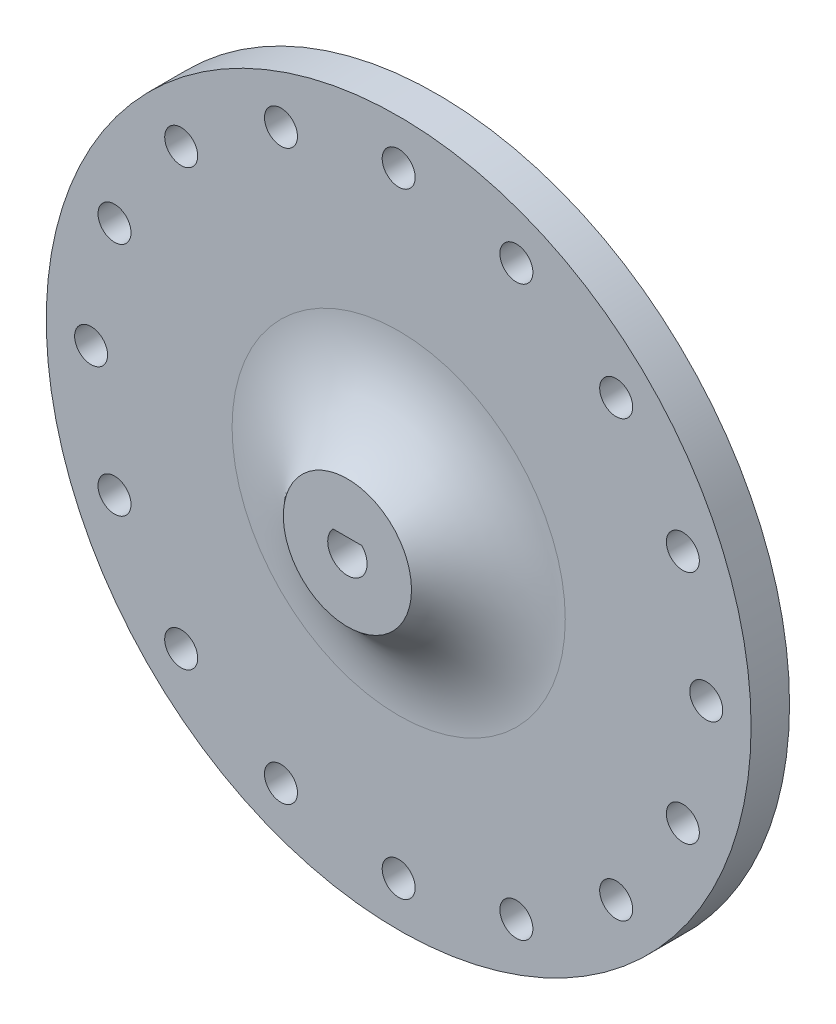
ISO-10303-21;
HEADER;
FILE_DESCRIPTION(('STEP AP214'),'2;1');
FILE_NAME('part.step','',(''),(''),'','','');
FILE_SCHEMA(('AUTOMOTIVE_DESIGN { 1 0 10303 214 1 1 1 1 }'));
ENDSEC;
DATA;
#1=APPLICATION_CONTEXT('core data for automotive mechanical design processes');
#2=APPLICATION_PROTOCOL_DEFINITION('international standard','automotive_design',2000,#1);
#3=PRODUCT_CONTEXT('',#1,'mechanical');
#4=PRODUCT('Part','Part','',(#3));
#5=PRODUCT_RELATED_PRODUCT_CATEGORY('part','',(#4));
#6=PRODUCT_DEFINITION_FORMATION('','',#4);
#7=PRODUCT_DEFINITION_CONTEXT('part definition',#1,'design');
#8=PRODUCT_DEFINITION('design','',#6,#7);
#9=PRODUCT_DEFINITION_SHAPE('','',#8);
#10=(LENGTH_UNIT() NAMED_UNIT(*) SI_UNIT(.MILLI.,.METRE.));
#11=(NAMED_UNIT(*) PLANE_ANGLE_UNIT() SI_UNIT($,.RADIAN.));
#12=(NAMED_UNIT(*) SI_UNIT($,.STERADIAN.) SOLID_ANGLE_UNIT());
#13=UNCERTAINTY_MEASURE_WITH_UNIT(LENGTH_MEASURE(1.E-05),#10,'distance_accuracy_value','');
#14=(GEOMETRIC_REPRESENTATION_CONTEXT(3) GLOBAL_UNCERTAINTY_ASSIGNED_CONTEXT((#13)) GLOBAL_UNIT_ASSIGNED_CONTEXT((#10,
#11,#12)) REPRESENTATION_CONTEXT('',''));
#15=CARTESIAN_POINT('',(0.,0.,0.));
#16=DIRECTION('',(0.,0.,1.));
#17=DIRECTION('',(1.,0.,0.));
#18=AXIS2_PLACEMENT_3D('',#15,#16,#17);
#19=CARTESIAN_POINT('',(0.,0.,6.));
#20=DIRECTION('',(0.,0.,-1.));
#21=DIRECTION('',(-1.,0.,0.));
#22=AXIS2_PLACEMENT_3D('',#19,#20,#21);
#23=CYLINDRICAL_SURFACE('',#22,55.);
#24=CARTESIAN_POINT('',(0.,0.,6.));
#25=DIRECTION('',(0.,0.,1.));
#26=DIRECTION('',(1.,0.,0.));
#27=AXIS2_PLACEMENT_3D('',#24,#25,#26);
#28=CIRCLE('',#27,55.);
#29=CARTESIAN_POINT('',(55.,0.,6.));
#30=VERTEX_POINT('',#29);
#31=EDGE_CURVE('E43',#30,#30,#28,.T.);
#32=ORIENTED_EDGE('',*,*,#31,.F.);
#33=EDGE_LOOP('',(#32));
#34=FACE_BOUND('',#33,.T.);
#35=CARTESIAN_POINT('',(0.,0.,0.));
#36=DIRECTION('',(0.,0.,1.));
#37=DIRECTION('',(1.,0.,0.));
#38=AXIS2_PLACEMENT_3D('',#35,#36,#37);
#39=CIRCLE('',#38,55.);
#40=CARTESIAN_POINT('',(55.,0.,0.));
#41=VERTEX_POINT('',#40);
#42=EDGE_CURVE('E180',#41,#41,#39,.T.);
#43=ORIENTED_EDGE('',*,*,#42,.T.);
#44=EDGE_LOOP('',(#43));
#45=FACE_BOUND('',#44,.T.);
#46=ADVANCED_FACE('F35',(#34,#45),#23,.T.);
#47=CARTESIAN_POINT('',(0.,0.,6.));
#48=DIRECTION('',(0.,0.,1.));
#49=DIRECTION('',(1.,0.,0.));
#50=AXIS2_PLACEMENT_3D('',#47,#48,#49);
#51=PLANE('',#50);
#52=CARTESIAN_POINT('',(33.9411254969543,33.9411254969542,6.));
#53=DIRECTION('',(0.,0.,1.));
#54=DIRECTION('',(0.707106781186546,-0.707106781186549,0.));
#55=AXIS2_PLACEMENT_3D('',#52,#53,#54);
#56=CIRCLE('',#55,2.575);
#57=CARTESIAN_POINT('',(35.7619254585097,32.1203255353989,6.));
#58=VERTEX_POINT('',#57);
#59=EDGE_CURVE('E119',#58,#58,#56,.T.);
#60=ORIENTED_EDGE('',*,*,#59,.F.);
#61=EDGE_LOOP('',(#60));
#62=FACE_BOUND('',#61,.T.);
#63=CARTESIAN_POINT('',(44.3462175605418,18.3688047535242,6.));
#64=DIRECTION('',(0.,0.,1.));
#65=DIRECTION('',(0.382683432365087,-0.923879532511288,0.));
#66=AXIS2_PLACEMENT_3D('',#63,#64,#65);
#67=CIRCLE('',#66,2.575);
#68=CARTESIAN_POINT('',(45.3316273988819,15.9898149573076,6.));
#69=VERTEX_POINT('',#68);
#70=EDGE_CURVE('E125',#69,#69,#67,.T.);
#71=ORIENTED_EDGE('',*,*,#70,.F.);
#72=EDGE_LOOP('',(#71));
#73=FACE_BOUND('',#72,.T.);
#74=CARTESIAN_POINT('',(48.,-1.6759110426447E-13,6.));
#75=DIRECTION('',(0.,0.,1.));
#76=DIRECTION('',(0.,-1.,0.));
#77=AXIS2_PLACEMENT_3D('',#74,#75,#76);
#78=CIRCLE('',#77,2.575);
#79=CARTESIAN_POINT('',(48.,-2.57500000000017,6.));
#80=VERTEX_POINT('',#79);
#81=EDGE_CURVE('E131',#80,#80,#78,.T.);
#82=ORIENTED_EDGE('',*,*,#81,.F.);
#83=EDGE_LOOP('',(#82));
#84=FACE_BOUND('',#83,.T.);
#85=CARTESIAN_POINT('',(44.3462175605417,-18.3688047535245,6.));
#86=DIRECTION('',(0.,0.,1.));
#87=DIRECTION('',(-0.382683432365094,-0.923879532511285,0.));
#88=AXIS2_PLACEMENT_3D('',#85,#86,#87);
#89=CIRCLE('',#88,2.575);
#90=CARTESIAN_POINT('',(43.3608077222016,-20.7477945497411,6.));
#91=VERTEX_POINT('',#90);
#92=EDGE_CURVE('E137',#91,#91,#89,.T.);
#93=ORIENTED_EDGE('',*,*,#92,.F.);
#94=EDGE_LOOP('',(#93));
#95=FACE_BOUND('',#94,.T.);
#96=CARTESIAN_POINT('',(33.9411254969541,-33.9411254969545,6.));
#97=DIRECTION('',(0.,0.,1.));
#98=DIRECTION('',(-0.707106781186551,-0.707106781186544,0.));
#99=AXIS2_PLACEMENT_3D('',#96,#97,#98);
#100=CIRCLE('',#99,2.575);
#101=CARTESIAN_POINT('',(32.1203255353987,-35.7619254585098,6.));
#102=VERTEX_POINT('',#101);
#103=EDGE_CURVE('E143',#102,#102,#100,.T.);
#104=ORIENTED_EDGE('',*,*,#103,.F.);
#105=EDGE_LOOP('',(#104));
#106=FACE_BOUND('',#105,.T.);
#107=CARTESIAN_POINT('',(18.368804753524,-44.3462175605419,6.));
#108=DIRECTION('',(0.,0.,1.));
#109=DIRECTION('',(-0.923879532511289,-0.382683432365084,0.));
#110=AXIS2_PLACEMENT_3D('',#107,#108,#109);
#111=CIRCLE('',#110,2.575);
#112=CARTESIAN_POINT('',(15.9898149573075,-45.331627398882,6.));
#113=VERTEX_POINT('',#112);
#114=EDGE_CURVE('E149',#113,#113,#111,.T.);
#115=ORIENTED_EDGE('',*,*,#114,.F.);
#116=EDGE_LOOP('',(#115));
#117=FACE_BOUND('',#116,.T.);
#118=CARTESIAN_POINT('',(0.,-48.,6.));
#119=DIRECTION('',(0.,0.,1.));
#120=DIRECTION('',(-1.,0.,0.));
#121=AXIS2_PLACEMENT_3D('',#118,#119,#120);
#122=CIRCLE('',#121,2.575);
#123=CARTESIAN_POINT('',(-2.575,-48.,6.));
#124=VERTEX_POINT('',#123);
#125=EDGE_CURVE('E155',#124,#124,#122,.T.);
#126=ORIENTED_EDGE('',*,*,#125,.F.);
#127=EDGE_LOOP('',(#126));
#128=FACE_BOUND('',#127,.T.);
#129=CARTESIAN_POINT('',(-18.3688047535247,-44.3462175605416,6.));
#130=DIRECTION('',(0.,0.,1.));
#131=DIRECTION('',(-0.923879532511284,0.382683432365097,0.));
#132=AXIS2_PLACEMENT_3D('',#129,#130,#131);
#133=CIRCLE('',#132,2.575);
#134=CARTESIAN_POINT('',(-20.7477945497412,-43.3608077222015,6.));
#135=VERTEX_POINT('',#134);
#136=EDGE_CURVE('E82',#135,#135,#133,.T.);
#137=ORIENTED_EDGE('',*,*,#136,.F.);
#138=EDGE_LOOP('',(#137));
#139=FACE_BOUND('',#138,.T.);
#140=CARTESIAN_POINT('',(-33.9411254969546,-33.941125496954,6.));
#141=DIRECTION('',(0.,0.,1.));
#142=DIRECTION('',(-0.707106781186541,0.707106781186554,0.));
#143=AXIS2_PLACEMENT_3D('',#140,#141,#142);
#144=CIRCLE('',#143,2.575);
#145=CARTESIAN_POINT('',(-35.7619254585099,-32.1203255353986,6.));
#146=VERTEX_POINT('',#145);
#147=EDGE_CURVE('E83',#146,#146,#144,.T.);
#148=ORIENTED_EDGE('',*,*,#147,.F.);
#149=EDGE_LOOP('',(#148));
#150=FACE_BOUND('',#149,.T.);
#151=CARTESIAN_POINT('',(-44.346217560542,-18.3688047535239,6.));
#152=DIRECTION('',(0.,0.,1.));
#153=DIRECTION('',(-0.382683432365081,0.923879532511291,0.));
#154=AXIS2_PLACEMENT_3D('',#151,#152,#153);
#155=CIRCLE('',#154,2.575);
#156=CARTESIAN_POINT('',(-45.331627398882,-15.9898149573073,6.));
#157=VERTEX_POINT('',#156);
#158=EDGE_CURVE('E89',#157,#157,#155,.T.);
#159=ORIENTED_EDGE('',*,*,#158,.F.);
#160=EDGE_LOOP('',(#159));
#161=FACE_BOUND('',#160,.T.);
#162=CARTESIAN_POINT('',(-48.,5.02773312793411E-13,6.));
#163=DIRECTION('',(0.,0.,1.));
#164=DIRECTION('',(0.,1.,0.));
#165=AXIS2_PLACEMENT_3D('',#162,#163,#164);
#166=CIRCLE('',#165,2.575);
#167=CARTESIAN_POINT('',(-48.,2.5750000000005,6.));
#168=VERTEX_POINT('',#167);
#169=EDGE_CURVE('E95',#168,#168,#166,.T.);
#170=ORIENTED_EDGE('',*,*,#169,.F.);
#171=EDGE_LOOP('',(#170));
#172=FACE_BOUND('',#171,.T.);
#173=CARTESIAN_POINT('',(-44.3462175605416,18.3688047535248,6.));
#174=DIRECTION('',(0.,0.,1.));
#175=DIRECTION('',(0.3826834323651,0.923879532511283,0.));
#176=AXIS2_PLACEMENT_3D('',#173,#174,#175);
#177=CIRCLE('',#176,2.575);
#178=CARTESIAN_POINT('',(-43.3608077222014,20.7477945497413,6.));
#179=VERTEX_POINT('',#178);
#180=EDGE_CURVE('E101',#179,#179,#177,.T.);
#181=ORIENTED_EDGE('',*,*,#180,.F.);
#182=EDGE_LOOP('',(#181));
#183=FACE_BOUND('',#182,.T.);
#184=CARTESIAN_POINT('',(-33.9411254969539,33.9411254969547,6.));
#185=DIRECTION('',(0.,0.,1.));
#186=DIRECTION('',(0.707106781186556,0.707106781186539,0.));
#187=AXIS2_PLACEMENT_3D('',#184,#185,#186);
#188=CIRCLE('',#187,2.575);
#189=CARTESIAN_POINT('',(-32.1203255353985,35.76192545851,6.));
#190=VERTEX_POINT('',#189);
#191=EDGE_CURVE('E107',#190,#190,#188,.T.);
#192=ORIENTED_EDGE('',*,*,#191,.F.);
#193=EDGE_LOOP('',(#192));
#194=FACE_BOUND('',#193,.T.);
#195=CARTESIAN_POINT('',(-18.3688047535237,44.346217560542,6.));
#196=DIRECTION('',(0.,0.,1.));
#197=DIRECTION('',(0.923879532511292,0.382683432365077,0.));
#198=AXIS2_PLACEMENT_3D('',#195,#196,#197);
#199=CIRCLE('',#198,2.575);
#200=CARTESIAN_POINT('',(-15.9898149573071,45.3316273988821,6.));
#201=VERTEX_POINT('',#200);
#202=EDGE_CURVE('E73',#201,#201,#199,.T.);
#203=ORIENTED_EDGE('',*,*,#202,.F.);
#204=EDGE_LOOP('',(#203));
#205=FACE_BOUND('',#204,.T.);
#206=CARTESIAN_POINT('',(18.3688047535244,44.3462175605418,6.));
#207=DIRECTION('',(0.,0.,1.));
#208=DIRECTION('',(0.923879532511287,-0.382683432365091,0.));
#209=AXIS2_PLACEMENT_3D('',#206,#207,#208);
#210=CIRCLE('',#209,2.575);
#211=CARTESIAN_POINT('',(20.7477945497409,43.3608077222016,6.));
#212=VERTEX_POINT('',#211);
#213=EDGE_CURVE('E118',#212,#212,#210,.T.);
#214=ORIENTED_EDGE('',*,*,#213,.F.);
#215=EDGE_LOOP('',(#214));
#216=FACE_BOUND('',#215,.T.);
#217=CARTESIAN_POINT('',(0.,48.,6.));
#218=DIRECTION('',(0.,0.,1.));
#219=DIRECTION('',(1.,0.,0.));
#220=AXIS2_PLACEMENT_3D('',#217,#218,#219);
#221=CIRCLE('',#220,2.575);
#222=CARTESIAN_POINT('',(2.575,48.,6.));
#223=VERTEX_POINT('',#222);
#224=EDGE_CURVE('E166',#223,#223,#221,.T.);
#225=ORIENTED_EDGE('',*,*,#224,.F.);
#226=EDGE_LOOP('',(#225));
#227=FACE_BOUND('',#226,.T.);
#228=CARTESIAN_POINT('',(0.,0.,6.));
#229=DIRECTION('',(0.,0.,1.));
#230=DIRECTION('',(1.,0.,0.));
#231=AXIS2_PLACEMENT_3D('',#228,#229,#230);
#232=CIRCLE('',#231,26.);
#233=CARTESIAN_POINT('',(26.,0.,6.));
#234=VERTEX_POINT('',#233);
#235=EDGE_CURVE('E11',#234,#234,#232,.F.);
#236=ORIENTED_EDGE('',*,*,#235,.T.);
#237=EDGE_LOOP('',(#236));
#238=FACE_BOUND('',#237,.T.);
#239=ORIENTED_EDGE('',*,*,#31,.T.);
#240=EDGE_LOOP('',(#239));
#241=FACE_BOUND('',#240,.T.);
#242=ADVANCED_FACE('F188',(#62,#73,#84,#95,#106,#117,#128,#139,#150,#161,#172,#183,#194,#205,
#216,#227,#238,#241),#51,.T.);
#243=CARTESIAN_POINT('',(0.,0.,0.));
#244=DIRECTION('',(0.,0.,1.));
#245=DIRECTION('',(1.,0.,0.));
#246=AXIS2_PLACEMENT_3D('',#243,#244,#245);
#247=PLANE('',#246);
#248=DIRECTION('',(-1.,0.,0.));
#249=VECTOR('',#248,1.);
#250=CARTESIAN_POINT('',(2.24624686978079,2.1,0.));
#251=LINE('',#250,#249);
#252=CARTESIAN_POINT('',(2.24624686978079,2.1,0.));
#253=VERTEX_POINT('',#252);
#254=CARTESIAN_POINT('',(-2.24624686978079,2.1,0.));
#255=VERTEX_POINT('',#254);
#256=EDGE_CURVE('E70',#253,#255,#251,.T.);
#257=ORIENTED_EDGE('',*,*,#256,.T.);
#258=CARTESIAN_POINT('',(0.,0.,0.));
#259=DIRECTION('',(0.,0.,1.));
#260=DIRECTION('',(1.,0.,0.));
#261=AXIS2_PLACEMENT_3D('',#258,#259,#260);
#262=CIRCLE('',#261,3.075);
#263=EDGE_CURVE('E63',#255,#253,#262,.T.);
#264=ORIENTED_EDGE('',*,*,#263,.T.);
#265=EDGE_LOOP('',(#257,#264));
#266=FACE_BOUND('',#265,.T.);
#267=CARTESIAN_POINT('',(33.9411254969543,33.9411254969542,0.));
#268=DIRECTION('',(0.,0.,1.));
#269=DIRECTION('',(0.707106781186546,-0.707106781186549,0.));
#270=AXIS2_PLACEMENT_3D('',#267,#268,#269);
#271=CIRCLE('',#270,2.575);
#272=CARTESIAN_POINT('',(35.7619254585097,32.1203255353989,0.));
#273=VERTEX_POINT('',#272);
#274=EDGE_CURVE('E115',#273,#273,#271,.T.);
#275=ORIENTED_EDGE('',*,*,#274,.T.);
#276=EDGE_LOOP('',(#275));
#277=FACE_BOUND('',#276,.T.);
#278=CARTESIAN_POINT('',(44.3462175605418,18.3688047535242,0.));
#279=DIRECTION('',(0.,0.,1.));
#280=DIRECTION('',(0.382683432365087,-0.923879532511288,0.));
#281=AXIS2_PLACEMENT_3D('',#278,#279,#280);
#282=CIRCLE('',#281,2.575);
#283=CARTESIAN_POINT('',(45.3316273988819,15.9898149573076,0.));
#284=VERTEX_POINT('',#283);
#285=EDGE_CURVE('E122',#284,#284,#282,.T.);
#286=ORIENTED_EDGE('',*,*,#285,.T.);
#287=EDGE_LOOP('',(#286));
#288=FACE_BOUND('',#287,.T.);
#289=CARTESIAN_POINT('',(48.,-1.6759110426447E-13,0.));
#290=DIRECTION('',(0.,0.,1.));
#291=DIRECTION('',(0.,-1.,0.));
#292=AXIS2_PLACEMENT_3D('',#289,#290,#291);
#293=CIRCLE('',#292,2.575);
#294=CARTESIAN_POINT('',(48.,-2.57500000000017,0.));
#295=VERTEX_POINT('',#294);
#296=EDGE_CURVE('E128',#295,#295,#293,.T.);
#297=ORIENTED_EDGE('',*,*,#296,.T.);
#298=EDGE_LOOP('',(#297));
#299=FACE_BOUND('',#298,.T.);
#300=CARTESIAN_POINT('',(44.3462175605417,-18.3688047535245,0.));
#301=DIRECTION('',(0.,0.,1.));
#302=DIRECTION('',(-0.382683432365094,-0.923879532511285,0.));
#303=AXIS2_PLACEMENT_3D('',#300,#301,#302);
#304=CIRCLE('',#303,2.575);
#305=CARTESIAN_POINT('',(43.3608077222016,-20.7477945497411,0.));
#306=VERTEX_POINT('',#305);
#307=EDGE_CURVE('E134',#306,#306,#304,.T.);
#308=ORIENTED_EDGE('',*,*,#307,.T.);
#309=EDGE_LOOP('',(#308));
#310=FACE_BOUND('',#309,.T.);
#311=CARTESIAN_POINT('',(33.9411254969541,-33.9411254969545,0.));
#312=DIRECTION('',(0.,0.,1.));
#313=DIRECTION('',(-0.707106781186551,-0.707106781186544,0.));
#314=AXIS2_PLACEMENT_3D('',#311,#312,#313);
#315=CIRCLE('',#314,2.575);
#316=CARTESIAN_POINT('',(32.1203255353987,-35.7619254585098,0.));
#317=VERTEX_POINT('',#316);
#318=EDGE_CURVE('E140',#317,#317,#315,.T.);
#319=ORIENTED_EDGE('',*,*,#318,.T.);
#320=EDGE_LOOP('',(#319));
#321=FACE_BOUND('',#320,.T.);
#322=CARTESIAN_POINT('',(18.368804753524,-44.3462175605419,0.));
#323=DIRECTION('',(0.,0.,1.));
#324=DIRECTION('',(-0.923879532511289,-0.382683432365084,0.));
#325=AXIS2_PLACEMENT_3D('',#322,#323,#324);
#326=CIRCLE('',#325,2.575);
#327=CARTESIAN_POINT('',(15.9898149573075,-45.331627398882,0.));
#328=VERTEX_POINT('',#327);
#329=EDGE_CURVE('E146',#328,#328,#326,.T.);
#330=ORIENTED_EDGE('',*,*,#329,.T.);
#331=EDGE_LOOP('',(#330));
#332=FACE_BOUND('',#331,.T.);
#333=CARTESIAN_POINT('',(0.,-48.,0.));
#334=DIRECTION('',(0.,0.,1.));
#335=DIRECTION('',(-1.,0.,0.));
#336=AXIS2_PLACEMENT_3D('',#333,#334,#335);
#337=CIRCLE('',#336,2.575);
#338=CARTESIAN_POINT('',(-2.575,-48.,0.));
#339=VERTEX_POINT('',#338);
#340=EDGE_CURVE('E152',#339,#339,#337,.T.);
#341=ORIENTED_EDGE('',*,*,#340,.T.);
#342=EDGE_LOOP('',(#341));
#343=FACE_BOUND('',#342,.T.);
#344=CARTESIAN_POINT('',(-18.3688047535247,-44.3462175605416,0.));
#345=DIRECTION('',(0.,0.,1.));
#346=DIRECTION('',(-0.923879532511284,0.382683432365097,0.));
#347=AXIS2_PLACEMENT_3D('',#344,#345,#346);
#348=CIRCLE('',#347,2.575);
#349=CARTESIAN_POINT('',(-20.7477945497412,-43.3608077222015,0.));
#350=VERTEX_POINT('',#349);
#351=EDGE_CURVE('E158',#350,#350,#348,.T.);
#352=ORIENTED_EDGE('',*,*,#351,.T.);
#353=EDGE_LOOP('',(#352));
#354=FACE_BOUND('',#353,.T.);
#355=CARTESIAN_POINT('',(-33.9411254969546,-33.941125496954,0.));
#356=DIRECTION('',(0.,0.,1.));
#357=DIRECTION('',(-0.707106781186541,0.707106781186554,0.));
#358=AXIS2_PLACEMENT_3D('',#355,#356,#357);
#359=CIRCLE('',#358,2.575);
#360=CARTESIAN_POINT('',(-35.7619254585099,-32.1203255353986,0.));
#361=VERTEX_POINT('',#360);
#362=EDGE_CURVE('E79',#361,#361,#359,.T.);
#363=ORIENTED_EDGE('',*,*,#362,.T.);
#364=EDGE_LOOP('',(#363));
#365=FACE_BOUND('',#364,.T.);
#366=CARTESIAN_POINT('',(-44.346217560542,-18.3688047535239,0.));
#367=DIRECTION('',(0.,0.,1.));
#368=DIRECTION('',(-0.382683432365081,0.923879532511291,0.));
#369=AXIS2_PLACEMENT_3D('',#366,#367,#368);
#370=CIRCLE('',#369,2.575);
#371=CARTESIAN_POINT('',(-45.331627398882,-15.9898149573073,0.));
#372=VERTEX_POINT('',#371);
#373=EDGE_CURVE('E86',#372,#372,#370,.T.);
#374=ORIENTED_EDGE('',*,*,#373,.T.);
#375=EDGE_LOOP('',(#374));
#376=FACE_BOUND('',#375,.T.);
#377=CARTESIAN_POINT('',(-48.,5.02773312793411E-13,0.));
#378=DIRECTION('',(0.,0.,1.));
#379=DIRECTION('',(0.,1.,0.));
#380=AXIS2_PLACEMENT_3D('',#377,#378,#379);
#381=CIRCLE('',#380,2.575);
#382=CARTESIAN_POINT('',(-48.,2.5750000000005,0.));
#383=VERTEX_POINT('',#382);
#384=EDGE_CURVE('E92',#383,#383,#381,.T.);
#385=ORIENTED_EDGE('',*,*,#384,.T.);
#386=EDGE_LOOP('',(#385));
#387=FACE_BOUND('',#386,.T.);
#388=CARTESIAN_POINT('',(-44.3462175605416,18.3688047535248,0.));
#389=DIRECTION('',(0.,0.,1.));
#390=DIRECTION('',(0.3826834323651,0.923879532511283,0.));
#391=AXIS2_PLACEMENT_3D('',#388,#389,#390);
#392=CIRCLE('',#391,2.575);
#393=CARTESIAN_POINT('',(-43.3608077222014,20.7477945497413,0.));
#394=VERTEX_POINT('',#393);
#395=EDGE_CURVE('E98',#394,#394,#392,.T.);
#396=ORIENTED_EDGE('',*,*,#395,.T.);
#397=EDGE_LOOP('',(#396));
#398=FACE_BOUND('',#397,.T.);
#399=CARTESIAN_POINT('',(-33.9411254969539,33.9411254969547,0.));
#400=DIRECTION('',(0.,0.,1.));
#401=DIRECTION('',(0.707106781186556,0.707106781186539,0.));
#402=AXIS2_PLACEMENT_3D('',#399,#400,#401);
#403=CIRCLE('',#402,2.575);
#404=CARTESIAN_POINT('',(-32.1203255353985,35.76192545851,0.));
#405=VERTEX_POINT('',#404);
#406=EDGE_CURVE('E104',#405,#405,#403,.T.);
#407=ORIENTED_EDGE('',*,*,#406,.T.);
#408=EDGE_LOOP('',(#407));
#409=FACE_BOUND('',#408,.T.);
#410=CARTESIAN_POINT('',(-18.3688047535237,44.346217560542,0.));
#411=DIRECTION('',(0.,0.,1.));
#412=DIRECTION('',(0.923879532511292,0.382683432365077,0.));
#413=AXIS2_PLACEMENT_3D('',#410,#411,#412);
#414=CIRCLE('',#413,2.575);
#415=CARTESIAN_POINT('',(-15.9898149573071,45.3316273988821,0.));
#416=VERTEX_POINT('',#415);
#417=EDGE_CURVE('E110',#416,#416,#414,.T.);
#418=ORIENTED_EDGE('',*,*,#417,.T.);
#419=EDGE_LOOP('',(#418));
#420=FACE_BOUND('',#419,.T.);
#421=CARTESIAN_POINT('',(18.3688047535244,44.3462175605418,0.));
#422=DIRECTION('',(0.,0.,1.));
#423=DIRECTION('',(0.923879532511287,-0.382683432365091,0.));
#424=AXIS2_PLACEMENT_3D('',#421,#422,#423);
#425=CIRCLE('',#424,2.575);
#426=CARTESIAN_POINT('',(20.7477945497409,43.3608077222016,0.));
#427=VERTEX_POINT('',#426);
#428=EDGE_CURVE('E163',#427,#427,#425,.T.);
#429=ORIENTED_EDGE('',*,*,#428,.T.);
#430=EDGE_LOOP('',(#429));
#431=FACE_BOUND('',#430,.T.);
#432=CARTESIAN_POINT('',(0.,48.,0.));
#433=DIRECTION('',(0.,0.,1.));
#434=DIRECTION('',(1.,0.,0.));
#435=AXIS2_PLACEMENT_3D('',#432,#433,#434);
#436=CIRCLE('',#435,2.575);
#437=CARTESIAN_POINT('',(2.575,48.,0.));
#438=VERTEX_POINT('',#437);
#439=EDGE_CURVE('E169',#438,#438,#436,.T.);
#440=ORIENTED_EDGE('',*,*,#439,.T.);
#441=EDGE_LOOP('',(#440));
#442=FACE_BOUND('',#441,.T.);
#443=ORIENTED_EDGE('',*,*,#42,.F.);
#444=EDGE_LOOP('',(#443));
#445=FACE_BOUND('',#444,.T.);
#446=ADVANCED_FACE('F75',(#266,#277,#288,#299,#310,#321,#332,#343,#354,#365,#376,#387,#398,#409,
#420,#431,#442,#445),#247,.F.);
#447=CARTESIAN_POINT('',(0.,0.,14.));
#448=DIRECTION('',(0.,0.,1.));
#449=DIRECTION('',(1.,0.,0.));
#450=AXIS2_PLACEMENT_3D('',#447,#448,#449);
#451=PLANE('',#450);
#452=CARTESIAN_POINT('',(0.,0.,14.));
#453=DIRECTION('',(0.,0.,1.));
#454=DIRECTION('',(1.,0.,0.));
#455=AXIS2_PLACEMENT_3D('',#452,#453,#454);
#456=CIRCLE('',#455,10.);
#457=CARTESIAN_POINT('',(10.,0.,14.));
#458=VERTEX_POINT('',#457);
#459=EDGE_CURVE('E68',#458,#458,#456,.T.);
#460=ORIENTED_EDGE('',*,*,#459,.T.);
#461=EDGE_LOOP('',(#460));
#462=FACE_BOUND('',#461,.T.);
#463=DIRECTION('',(-1.,0.,0.));
#464=VECTOR('',#463,1.);
#465=CARTESIAN_POINT('',(-2.24624686978079,2.1,14.));
#466=LINE('',#465,#464);
#467=CARTESIAN_POINT('',(2.24624686978079,2.1,14.));
#468=VERTEX_POINT('',#467);
#469=CARTESIAN_POINT('',(-2.24624686978079,2.1,14.));
#470=VERTEX_POINT('',#469);
#471=EDGE_CURVE('E175',#468,#470,#466,.T.);
#472=ORIENTED_EDGE('',*,*,#471,.F.);
#473=CARTESIAN_POINT('',(0.,0.,14.));
#474=DIRECTION('',(0.,0.,1.));
#475=DIRECTION('',(1.,0.,0.));
#476=AXIS2_PLACEMENT_3D('',#473,#474,#475);
#477=CIRCLE('',#476,3.075);
#478=EDGE_CURVE('E66',#470,#468,#477,.T.);
#479=ORIENTED_EDGE('',*,*,#478,.F.);
#480=EDGE_LOOP('',(#472,#479));
#481=FACE_BOUND('',#480,.T.);
#482=ADVANCED_FACE('F187',(#462,#481),#451,.T.);
#483=CARTESIAN_POINT('',(0.,0.,14.));
#484=DIRECTION('',(0.,0.,-1.));
#485=DIRECTION('',(-1.,0.,0.));
#486=AXIS2_PLACEMENT_3D('',#483,#484,#485);
#487=CYLINDRICAL_SURFACE('',#486,3.075);
#488=DIRECTION('',(0.,0.,-1.));
#489=VECTOR('',#488,1.);
#490=CARTESIAN_POINT('',(2.24624686978079,2.1,14.));
#491=LINE('',#490,#489);
#492=EDGE_CURVE('E55',#468,#253,#491,.T.);
#493=ORIENTED_EDGE('',*,*,#492,.T.);
#494=ORIENTED_EDGE('',*,*,#263,.F.);
#495=DIRECTION('',(0.,0.,-1.));
#496=VECTOR('',#495,1.);
#497=CARTESIAN_POINT('',(-2.24624686978079,2.1,14.));
#498=LINE('',#497,#496);
#499=EDGE_CURVE('E50',#470,#255,#498,.T.);
#500=ORIENTED_EDGE('',*,*,#499,.F.);
#501=ORIENTED_EDGE('',*,*,#478,.T.);
#502=EDGE_LOOP('',(#493,#494,#500,#501));
#503=FACE_BOUND('',#502,.T.);
#504=ADVANCED_FACE('F61',(#503),#487,.F.);
#505=CARTESIAN_POINT('',(-2.24624686978079,2.1,14.));
#506=DIRECTION('',(0.,-1.,0.));
#507=DIRECTION('',(0.,0.,-1.));
#508=AXIS2_PLACEMENT_3D('',#505,#506,#507);
#509=PLANE('',#508);
#510=ORIENTED_EDGE('',*,*,#499,.T.);
#511=ORIENTED_EDGE('',*,*,#256,.F.);
#512=ORIENTED_EDGE('',*,*,#492,.F.);
#513=ORIENTED_EDGE('',*,*,#471,.T.);
#514=EDGE_LOOP('',(#510,#511,#512,#513));
#515=FACE_BOUND('',#514,.T.);
#516=ADVANCED_FACE('F71',(#515),#509,.T.);
#517=CARTESIAN_POINT('',(0.,0.,26.));
#518=DIRECTION('',(0.,0.,1.));
#519=DIRECTION('',(1.,0.,0.));
#520=AXIS2_PLACEMENT_3D('',#517,#518,#519);
#521=TOROIDAL_SURFACE('',#520,26.,20.);
#522=ORIENTED_EDGE('',*,*,#235,.F.);
#523=EDGE_LOOP('',(#522));
#524=FACE_BOUND('',#523,.T.);
#525=ORIENTED_EDGE('',*,*,#459,.F.);
#526=EDGE_LOOP('',(#525));
#527=FACE_BOUND('',#526,.T.);
#528=ADVANCED_FACE('F37',(#524,#527),#521,.F.);
#529=CARTESIAN_POINT('',(0.,48.,0.));
#530=DIRECTION('',(0.,0.,1.));
#531=DIRECTION('',(1.,0.,0.));
#532=AXIS2_PLACEMENT_3D('',#529,#530,#531);
#533=CYLINDRICAL_SURFACE('',#532,2.575);
#534=ORIENTED_EDGE('',*,*,#439,.F.);
#535=EDGE_LOOP('',(#534));
#536=FACE_BOUND('',#535,.T.);
#537=ORIENTED_EDGE('',*,*,#224,.T.);
#538=EDGE_LOOP('',(#537));
#539=FACE_BOUND('',#538,.T.);
#540=ADVANCED_FACE('F216',(#536,#539),#533,.F.);
#541=CARTESIAN_POINT('',(18.3688047535244,44.3462175605418,0.));
#542=DIRECTION('',(0.,0.,1.));
#543=DIRECTION('',(1.,0.,0.));
#544=AXIS2_PLACEMENT_3D('',#541,#542,#543);
#545=CYLINDRICAL_SURFACE('',#544,2.575);
#546=ORIENTED_EDGE('',*,*,#428,.F.);
#547=EDGE_LOOP('',(#546));
#548=FACE_BOUND('',#547,.T.);
#549=ORIENTED_EDGE('',*,*,#213,.T.);
#550=EDGE_LOOP('',(#549));
#551=FACE_BOUND('',#550,.T.);
#552=ADVANCED_FACE('F221',(#548,#551),#545,.F.);
#553=CARTESIAN_POINT('',(-18.3688047535237,44.346217560542,0.));
#554=DIRECTION('',(0.,0.,1.));
#555=DIRECTION('',(1.,0.,0.));
#556=AXIS2_PLACEMENT_3D('',#553,#554,#555);
#557=CYLINDRICAL_SURFACE('',#556,2.575);
#558=ORIENTED_EDGE('',*,*,#417,.F.);
#559=EDGE_LOOP('',(#558));
#560=FACE_BOUND('',#559,.T.);
#561=ORIENTED_EDGE('',*,*,#202,.T.);
#562=EDGE_LOOP('',(#561));
#563=FACE_BOUND('',#562,.T.);
#564=ADVANCED_FACE('F226',(#560,#563),#557,.F.);
#565=CARTESIAN_POINT('',(-33.9411254969539,33.9411254969547,0.));
#566=DIRECTION('',(0.,0.,1.));
#567=DIRECTION('',(1.,0.,0.));
#568=AXIS2_PLACEMENT_3D('',#565,#566,#567);
#569=CYLINDRICAL_SURFACE('',#568,2.575);
#570=ORIENTED_EDGE('',*,*,#406,.F.);
#571=EDGE_LOOP('',(#570));
#572=FACE_BOUND('',#571,.T.);
#573=ORIENTED_EDGE('',*,*,#191,.T.);
#574=EDGE_LOOP('',(#573));
#575=FACE_BOUND('',#574,.T.);
#576=ADVANCED_FACE('F236',(#572,#575),#569,.F.);
#577=CARTESIAN_POINT('',(-44.3462175605416,18.3688047535248,0.));
#578=DIRECTION('',(0.,0.,1.));
#579=DIRECTION('',(1.,0.,0.));
#580=AXIS2_PLACEMENT_3D('',#577,#578,#579);
#581=CYLINDRICAL_SURFACE('',#580,2.575);
#582=ORIENTED_EDGE('',*,*,#395,.F.);
#583=EDGE_LOOP('',(#582));
#584=FACE_BOUND('',#583,.T.);
#585=ORIENTED_EDGE('',*,*,#180,.T.);
#586=EDGE_LOOP('',(#585));
#587=FACE_BOUND('',#586,.T.);
#588=ADVANCED_FACE('F246',(#584,#587),#581,.F.);
#589=CARTESIAN_POINT('',(-48.,5.02773312793411E-13,0.));
#590=DIRECTION('',(0.,0.,1.));
#591=DIRECTION('',(1.,0.,0.));
#592=AXIS2_PLACEMENT_3D('',#589,#590,#591);
#593=CYLINDRICAL_SURFACE('',#592,2.575);
#594=ORIENTED_EDGE('',*,*,#384,.F.);
#595=EDGE_LOOP('',(#594));
#596=FACE_BOUND('',#595,.T.);
#597=ORIENTED_EDGE('',*,*,#169,.T.);
#598=EDGE_LOOP('',(#597));
#599=FACE_BOUND('',#598,.T.);
#600=ADVANCED_FACE('F256',(#596,#599),#593,.F.);
#601=CARTESIAN_POINT('',(-44.346217560542,-18.3688047535239,0.));
#602=DIRECTION('',(0.,0.,1.));
#603=DIRECTION('',(1.,0.,0.));
#604=AXIS2_PLACEMENT_3D('',#601,#602,#603);
#605=CYLINDRICAL_SURFACE('',#604,2.575);
#606=ORIENTED_EDGE('',*,*,#373,.F.);
#607=EDGE_LOOP('',(#606));
#608=FACE_BOUND('',#607,.T.);
#609=ORIENTED_EDGE('',*,*,#158,.T.);
#610=EDGE_LOOP('',(#609));
#611=FACE_BOUND('',#610,.T.);
#612=ADVANCED_FACE('F266',(#608,#611),#605,.F.);
#613=CARTESIAN_POINT('',(-33.9411254969546,-33.941125496954,0.));
#614=DIRECTION('',(0.,0.,1.));
#615=DIRECTION('',(1.,0.,0.));
#616=AXIS2_PLACEMENT_3D('',#613,#614,#615);
#617=CYLINDRICAL_SURFACE('',#616,2.575);
#618=ORIENTED_EDGE('',*,*,#362,.F.);
#619=EDGE_LOOP('',(#618));
#620=FACE_BOUND('',#619,.T.);
#621=ORIENTED_EDGE('',*,*,#147,.T.);
#622=EDGE_LOOP('',(#621));
#623=FACE_BOUND('',#622,.T.);
#624=ADVANCED_FACE('F276',(#620,#623),#617,.F.);
#625=CARTESIAN_POINT('',(-18.3688047535247,-44.3462175605416,0.));
#626=DIRECTION('',(0.,0.,1.));
#627=DIRECTION('',(1.,0.,0.));
#628=AXIS2_PLACEMENT_3D('',#625,#626,#627);
#629=CYLINDRICAL_SURFACE('',#628,2.575);
#630=ORIENTED_EDGE('',*,*,#351,.F.);
#631=EDGE_LOOP('',(#630));
#632=FACE_BOUND('',#631,.T.);
#633=ORIENTED_EDGE('',*,*,#136,.T.);
#634=EDGE_LOOP('',(#633));
#635=FACE_BOUND('',#634,.T.);
#636=ADVANCED_FACE('F286',(#632,#635),#629,.F.);
#637=CARTESIAN_POINT('',(0.,-48.,0.));
#638=DIRECTION('',(0.,0.,1.));
#639=DIRECTION('',(1.,0.,0.));
#640=AXIS2_PLACEMENT_3D('',#637,#638,#639);
#641=CYLINDRICAL_SURFACE('',#640,2.575);
#642=ORIENTED_EDGE('',*,*,#340,.F.);
#643=EDGE_LOOP('',(#642));
#644=FACE_BOUND('',#643,.T.);
#645=ORIENTED_EDGE('',*,*,#125,.T.);
#646=EDGE_LOOP('',(#645));
#647=FACE_BOUND('',#646,.T.);
#648=ADVANCED_FACE('F296',(#644,#647),#641,.F.);
#649=CARTESIAN_POINT('',(18.368804753524,-44.3462175605419,0.));
#650=DIRECTION('',(0.,0.,1.));
#651=DIRECTION('',(1.,0.,0.));
#652=AXIS2_PLACEMENT_3D('',#649,#650,#651);
#653=CYLINDRICAL_SURFACE('',#652,2.575);
#654=ORIENTED_EDGE('',*,*,#329,.F.);
#655=EDGE_LOOP('',(#654));
#656=FACE_BOUND('',#655,.T.);
#657=ORIENTED_EDGE('',*,*,#114,.T.);
#658=EDGE_LOOP('',(#657));
#659=FACE_BOUND('',#658,.T.);
#660=ADVANCED_FACE('F306',(#656,#659),#653,.F.);
#661=CARTESIAN_POINT('',(33.9411254969541,-33.9411254969545,0.));
#662=DIRECTION('',(0.,0.,1.));
#663=DIRECTION('',(1.,0.,0.));
#664=AXIS2_PLACEMENT_3D('',#661,#662,#663);
#665=CYLINDRICAL_SURFACE('',#664,2.575);
#666=ORIENTED_EDGE('',*,*,#318,.F.);
#667=EDGE_LOOP('',(#666));
#668=FACE_BOUND('',#667,.T.);
#669=ORIENTED_EDGE('',*,*,#103,.T.);
#670=EDGE_LOOP('',(#669));
#671=FACE_BOUND('',#670,.T.);
#672=ADVANCED_FACE('F316',(#668,#671),#665,.F.);
#673=CARTESIAN_POINT('',(44.3462175605417,-18.3688047535245,0.));
#674=DIRECTION('',(0.,0.,1.));
#675=DIRECTION('',(1.,0.,0.));
#676=AXIS2_PLACEMENT_3D('',#673,#674,#675);
#677=CYLINDRICAL_SURFACE('',#676,2.575);
#678=ORIENTED_EDGE('',*,*,#307,.F.);
#679=EDGE_LOOP('',(#678));
#680=FACE_BOUND('',#679,.T.);
#681=ORIENTED_EDGE('',*,*,#92,.T.);
#682=EDGE_LOOP('',(#681));
#683=FACE_BOUND('',#682,.T.);
#684=ADVANCED_FACE('F326',(#680,#683),#677,.F.);
#685=CARTESIAN_POINT('',(48.,-1.6759110426447E-13,0.));
#686=DIRECTION('',(0.,0.,1.));
#687=DIRECTION('',(1.,0.,0.));
#688=AXIS2_PLACEMENT_3D('',#685,#686,#687);
#689=CYLINDRICAL_SURFACE('',#688,2.575);
#690=ORIENTED_EDGE('',*,*,#296,.F.);
#691=EDGE_LOOP('',(#690));
#692=FACE_BOUND('',#691,.T.);
#693=ORIENTED_EDGE('',*,*,#81,.T.);
#694=EDGE_LOOP('',(#693));
#695=FACE_BOUND('',#694,.T.);
#696=ADVANCED_FACE('F336',(#692,#695),#689,.F.);
#697=CARTESIAN_POINT('',(44.3462175605418,18.3688047535242,0.));
#698=DIRECTION('',(0.,0.,1.));
#699=DIRECTION('',(1.,0.,0.));
#700=AXIS2_PLACEMENT_3D('',#697,#698,#699);
#701=CYLINDRICAL_SURFACE('',#700,2.575);
#702=ORIENTED_EDGE('',*,*,#285,.F.);
#703=EDGE_LOOP('',(#702));
#704=FACE_BOUND('',#703,.T.);
#705=ORIENTED_EDGE('',*,*,#70,.T.);
#706=EDGE_LOOP('',(#705));
#707=FACE_BOUND('',#706,.T.);
#708=ADVANCED_FACE('F346',(#704,#707),#701,.F.);
#709=CARTESIAN_POINT('',(33.9411254969543,33.9411254969542,0.));
#710=DIRECTION('',(0.,0.,1.));
#711=DIRECTION('',(1.,0.,0.));
#712=AXIS2_PLACEMENT_3D('',#709,#710,#711);
#713=CYLINDRICAL_SURFACE('',#712,2.575);
#714=ORIENTED_EDGE('',*,*,#274,.F.);
#715=EDGE_LOOP('',(#714));
#716=FACE_BOUND('',#715,.T.);
#717=ORIENTED_EDGE('',*,*,#59,.T.);
#718=EDGE_LOOP('',(#717));
#719=FACE_BOUND('',#718,.T.);
#720=ADVANCED_FACE('F356',(#716,#719),#713,.F.);
#721=CLOSED_SHELL('',(#46,#242,#446,#482,#504,#516,#528,#540,#552,#564,#576,#588,#600,#612,#624,
#636,#648,#660,#672,#684,#696,#708,#720));
#722=MANIFOLD_SOLID_BREP('B2',#721);
#723=ADVANCED_BREP_SHAPE_REPRESENTATION('',(#18,#722),#14);
#724=SHAPE_DEFINITION_REPRESENTATION(#9,#723);
ENDSEC;
END-ISO-10303-21;
